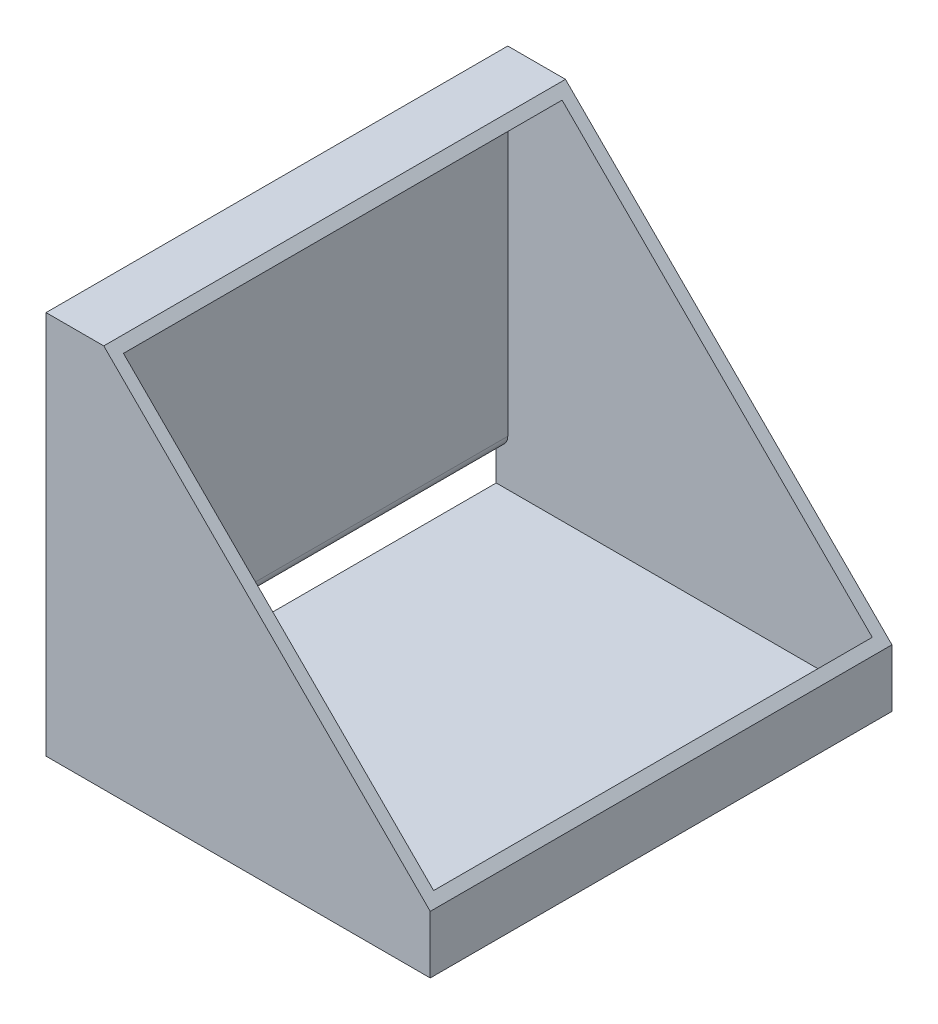
ISO-10303-21;
HEADER;
FILE_DESCRIPTION(('STEP AP214'),'2;1');
FILE_NAME('part.step','',(''),(''),'','','');
FILE_SCHEMA(('AUTOMOTIVE_DESIGN { 1 0 10303 214 1 1 1 1 }'));
ENDSEC;
DATA;
#1=APPLICATION_CONTEXT('core data for automotive mechanical design processes');
#2=APPLICATION_PROTOCOL_DEFINITION('international standard','automotive_design',2000,#1);
#3=PRODUCT_CONTEXT('',#1,'mechanical');
#4=PRODUCT('Part','Part','',(#3));
#5=PRODUCT_RELATED_PRODUCT_CATEGORY('part','',(#4));
#6=PRODUCT_DEFINITION_FORMATION('','',#4);
#7=PRODUCT_DEFINITION_CONTEXT('part definition',#1,'design');
#8=PRODUCT_DEFINITION('design','',#6,#7);
#9=PRODUCT_DEFINITION_SHAPE('','',#8);
#10=(LENGTH_UNIT() NAMED_UNIT(*) SI_UNIT(.MILLI.,.METRE.));
#11=(NAMED_UNIT(*) PLANE_ANGLE_UNIT() SI_UNIT($,.RADIAN.));
#12=(NAMED_UNIT(*) SI_UNIT($,.STERADIAN.) SOLID_ANGLE_UNIT());
#13=UNCERTAINTY_MEASURE_WITH_UNIT(LENGTH_MEASURE(1.E-05),#10,'distance_accuracy_value','');
#14=(GEOMETRIC_REPRESENTATION_CONTEXT(3) GLOBAL_UNCERTAINTY_ASSIGNED_CONTEXT((#13)) GLOBAL_UNIT_ASSIGNED_CONTEXT((#10,
#11,#12)) REPRESENTATION_CONTEXT('',''));
#15=CARTESIAN_POINT('',(0.,0.,0.));
#16=DIRECTION('',(0.,0.,1.));
#17=DIRECTION('',(1.,0.,0.));
#18=AXIS2_PLACEMENT_3D('',#15,#16,#17);
#19=CARTESIAN_POINT('',(18.4350288425444,18.4350288425444,-39.));
#20=DIRECTION('',(0.707106781186548,0.707106781186548,0.));
#21=DIRECTION('',(-0.707106781186548,0.707106781186548,0.));
#22=AXIS2_PLACEMENT_3D('',#19,#20,#21);
#23=PLANE('',#22);
#24=DIRECTION('',(-0.707106781186548,0.707106781186548,0.));
#25=VECTOR('',#24,1.);
#26=CARTESIAN_POINT('',(18.4350288425444,18.4350288425444,-39.));
#27=LINE('',#26,#25);
#28=CARTESIAN_POINT('',(5.00000000000001,31.8700576850888,-39.));
#29=VERTEX_POINT('',#28);
#30=CARTESIAN_POINT('',(4.58578643762691,32.2842712474619,-39.));
#31=VERTEX_POINT('',#30);
#32=EDGE_CURVE('E234',#29,#31,#27,.T.);
#33=ORIENTED_EDGE('',*,*,#32,.F.);
#34=DIRECTION('',(0.,0.,1.));
#35=VECTOR('',#34,1.);
#36=CARTESIAN_POINT('',(5.,31.8700576850888,-39.));
#37=LINE('',#36,#35);
#38=CARTESIAN_POINT('',(5.00000000000001,31.8700576850888,-0.999999999999999));
#39=VERTEX_POINT('',#38);
#40=EDGE_CURVE('E226',#29,#39,#37,.T.);
#41=ORIENTED_EDGE('',*,*,#40,.T.);
#42=DIRECTION('',(-0.707106781186548,0.707106781186548,0.));
#43=VECTOR('',#42,1.);
#44=CARTESIAN_POINT('',(18.4350288425444,18.4350288425444,-1.));
#45=LINE('',#44,#43);
#46=CARTESIAN_POINT('',(4.58578643762691,32.2842712474619,-1.));
#47=VERTEX_POINT('',#46);
#48=EDGE_CURVE('E229',#39,#47,#45,.T.);
#49=ORIENTED_EDGE('',*,*,#48,.T.);
#50=DIRECTION('',(0.,0.,1.));
#51=VECTOR('',#50,1.);
#52=CARTESIAN_POINT('',(4.58578643762691,32.2842712474619,-39.));
#53=LINE('',#52,#51);
#54=EDGE_CURVE('E244',#31,#47,#53,.T.);
#55=ORIENTED_EDGE('',*,*,#54,.F.);
#56=EDGE_LOOP('',(#33,#41,#49,#55));
#57=FACE_BOUND('',#56,.T.);
#58=ADVANCED_FACE('F63',(#57),#23,.F.);
#59=CARTESIAN_POINT('',(32.2842712474619,4.58578643762691,-1.));
#60=VERTEX_POINT('',#59);
#61=CARTESIAN_POINT('',(31.8700576850888,5.00000000000001,-0.999999999999998));
#62=VERTEX_POINT('',#61);
#63=EDGE_CURVE('E245',#60,#62,#45,.T.);
#64=ORIENTED_EDGE('',*,*,#63,.T.);
#65=DIRECTION('',(0.,0.,-1.));
#66=VECTOR('',#65,1.);
#67=CARTESIAN_POINT('',(31.8700576850888,5.,-39.));
#68=LINE('',#67,#66);
#69=CARTESIAN_POINT('',(31.8700576850888,5.,-39.));
#70=VERTEX_POINT('',#69);
#71=EDGE_CURVE('E217',#62,#70,#68,.T.);
#72=ORIENTED_EDGE('',*,*,#71,.T.);
#73=CARTESIAN_POINT('',(32.2842712474619,4.58578643762691,-39.));
#74=VERTEX_POINT('',#73);
#75=EDGE_CURVE('E230',#74,#70,#27,.T.);
#76=ORIENTED_EDGE('',*,*,#75,.F.);
#77=DIRECTION('',(0.,0.,1.));
#78=VECTOR('',#77,1.);
#79=CARTESIAN_POINT('',(32.2842712474619,4.58578643762691,-39.));
#80=LINE('',#79,#78);
#81=EDGE_CURVE('E253',#74,#60,#80,.T.);
#82=ORIENTED_EDGE('',*,*,#81,.T.);
#83=EDGE_LOOP('',(#64,#72,#76,#82));
#84=FACE_BOUND('',#83,.T.);
#85=ADVANCED_FACE('F329',(#84),#23,.F.);
#86=CARTESIAN_POINT('',(32.2842712474619,0.,-39.));
#87=DIRECTION('',(1.,0.,0.));
#88=DIRECTION('',(0.,0.,-1.));
#89=AXIS2_PLACEMENT_3D('',#86,#87,#88);
#90=PLANE('',#89);
#91=DIRECTION('',(0.,1.,0.));
#92=VECTOR('',#91,1.);
#93=CARTESIAN_POINT('',(32.2842712474619,0.,-1.));
#94=LINE('',#93,#92);
#95=CARTESIAN_POINT('',(32.2842712474619,1.,-1.));
#96=VERTEX_POINT('',#95);
#97=EDGE_CURVE('E181',#96,#60,#94,.T.);
#98=ORIENTED_EDGE('',*,*,#97,.T.);
#99=ORIENTED_EDGE('',*,*,#81,.F.);
#100=DIRECTION('',(0.,1.,0.));
#101=VECTOR('',#100,1.);
#102=CARTESIAN_POINT('',(32.2842712474619,0.,-39.));
#103=LINE('',#102,#101);
#104=CARTESIAN_POINT('',(32.2842712474619,1.,-39.));
#105=VERTEX_POINT('',#104);
#106=EDGE_CURVE('E241',#105,#74,#103,.T.);
#107=ORIENTED_EDGE('',*,*,#106,.F.);
#108=DIRECTION('',(0.,0.,1.));
#109=VECTOR('',#108,1.);
#110=CARTESIAN_POINT('',(32.2842712474619,1.,-39.));
#111=LINE('',#110,#109);
#112=EDGE_CURVE('E256',#105,#96,#111,.T.);
#113=ORIENTED_EDGE('',*,*,#112,.T.);
#114=EDGE_LOOP('',(#98,#99,#107,#113));
#115=FACE_BOUND('',#114,.T.);
#116=ADVANCED_FACE('F333',(#115),#90,.F.);
#117=CARTESIAN_POINT('',(0.,1.,-39.));
#118=DIRECTION('',(0.,-1.,0.));
#119=DIRECTION('',(0.,0.,-1.));
#120=AXIS2_PLACEMENT_3D('',#117,#118,#119);
#121=PLANE('',#120);
#122=ORIENTED_EDGE('',*,*,#112,.F.);
#123=DIRECTION('',(1.,0.,0.));
#124=VECTOR('',#123,1.);
#125=CARTESIAN_POINT('',(0.,1.,-39.));
#126=LINE('',#125,#124);
#127=CARTESIAN_POINT('',(0.,1.,-39.));
#128=VERTEX_POINT('',#127);
#129=EDGE_CURVE('E190',#128,#105,#126,.T.);
#130=ORIENTED_EDGE('',*,*,#129,.F.);
#131=DIRECTION('',(0.,0.,1.));
#132=VECTOR('',#131,1.);
#133=CARTESIAN_POINT('',(0.,1.,-39.));
#134=LINE('',#133,#132);
#135=CARTESIAN_POINT('',(0.,1.,-1.));
#136=VERTEX_POINT('',#135);
#137=EDGE_CURVE('E188',#128,#136,#134,.T.);
#138=ORIENTED_EDGE('',*,*,#137,.T.);
#139=DIRECTION('',(1.,0.,0.));
#140=VECTOR('',#139,1.);
#141=CARTESIAN_POINT('',(0.,1.,-1.));
#142=LINE('',#141,#140);
#143=EDGE_CURVE('E173',#136,#96,#142,.T.);
#144=ORIENTED_EDGE('',*,*,#143,.T.);
#145=EDGE_LOOP('',(#122,#130,#138,#144));
#146=FACE_BOUND('',#145,.T.);
#147=ADVANCED_FACE('F189',(#146),#121,.F.);
#148=CARTESIAN_POINT('',(1.,0.,-39.));
#149=DIRECTION('',(-1.,0.,0.));
#150=DIRECTION('',(0.,0.,1.));
#151=AXIS2_PLACEMENT_3D('',#148,#149,#150);
#152=PLANE('',#151);
#153=DIRECTION('',(0.,-1.,0.));
#154=VECTOR('',#153,1.);
#155=CARTESIAN_POINT('',(1.,0.,-1.));
#156=LINE('',#155,#154);
#157=CARTESIAN_POINT('',(1.,32.2842712474619,-1.));
#158=VERTEX_POINT('',#157);
#159=CARTESIAN_POINT('',(1.,5.,-1.));
#160=VERTEX_POINT('',#159);
#161=EDGE_CURVE('E185',#158,#160,#156,.T.);
#162=ORIENTED_EDGE('',*,*,#161,.T.);
#163=DIRECTION('',(0.,0.,-1.));
#164=VECTOR('',#163,1.);
#165=CARTESIAN_POINT('',(1.,5.,-39.));
#166=LINE('',#165,#164);
#167=CARTESIAN_POINT('',(1.,5.,-39.));
#168=VERTEX_POINT('',#167);
#169=EDGE_CURVE('E294',#160,#168,#166,.T.);
#170=ORIENTED_EDGE('',*,*,#169,.T.);
#171=DIRECTION('',(0.,-1.,0.));
#172=VECTOR('',#171,1.);
#173=CARTESIAN_POINT('',(1.,0.,-39.));
#174=LINE('',#173,#172);
#175=CARTESIAN_POINT('',(1.,32.2842712474619,-39.));
#176=VERTEX_POINT('',#175);
#177=EDGE_CURVE('E237',#176,#168,#174,.T.);
#178=ORIENTED_EDGE('',*,*,#177,.F.);
#179=DIRECTION('',(0.,0.,1.));
#180=VECTOR('',#179,1.);
#181=CARTESIAN_POINT('',(1.,32.2842712474619,-39.));
#182=LINE('',#181,#180);
#183=EDGE_CURVE('E258',#176,#158,#182,.T.);
#184=ORIENTED_EDGE('',*,*,#183,.T.);
#185=EDGE_LOOP('',(#162,#170,#178,#184));
#186=FACE_BOUND('',#185,.T.);
#187=ADVANCED_FACE('F306',(#186),#152,.F.);
#188=CARTESIAN_POINT('',(0.,32.2842712474619,-39.));
#189=DIRECTION('',(0.,1.,0.));
#190=DIRECTION('',(0.,0.,1.));
#191=AXIS2_PLACEMENT_3D('',#188,#189,#190);
#192=PLANE('',#191);
#193=DIRECTION('',(-1.,0.,0.));
#194=VECTOR('',#193,1.);
#195=CARTESIAN_POINT('',(0.,32.2842712474619,-1.));
#196=LINE('',#195,#194);
#197=EDGE_CURVE('E248',#47,#158,#196,.T.);
#198=ORIENTED_EDGE('',*,*,#197,.T.);
#199=ORIENTED_EDGE('',*,*,#183,.F.);
#200=DIRECTION('',(-1.,0.,0.));
#201=VECTOR('',#200,1.);
#202=CARTESIAN_POINT('',(0.,32.2842712474619,-39.));
#203=LINE('',#202,#201);
#204=EDGE_CURVE('E233',#31,#176,#203,.T.);
#205=ORIENTED_EDGE('',*,*,#204,.F.);
#206=ORIENTED_EDGE('',*,*,#54,.T.);
#207=EDGE_LOOP('',(#198,#199,#205,#206));
#208=FACE_BOUND('',#207,.T.);
#209=ADVANCED_FACE('F310',(#208),#192,.F.);
#210=CARTESIAN_POINT('',(0.,0.,-39.));
#211=DIRECTION('',(0.,0.,1.));
#212=DIRECTION('',(1.,0.,0.));
#213=AXIS2_PLACEMENT_3D('',#210,#211,#212);
#214=PLANE('',#213);
#215=ORIENTED_EDGE('',*,*,#177,.T.);
#216=CARTESIAN_POINT('',(0.,5.,-39.));
#217=DIRECTION('',(0.,0.,1.));
#218=DIRECTION('',(1.,0.,0.));
#219=AXIS2_PLACEMENT_3D('',#216,#217,#218);
#220=CIRCLE('',#219,1.);
#221=CARTESIAN_POINT('',(0.,4.,-39.));
#222=VERTEX_POINT('',#221);
#223=EDGE_CURVE('E71',#168,#222,#220,.F.);
#224=ORIENTED_EDGE('',*,*,#223,.T.);
#225=DIRECTION('',(0.,-1.,0.));
#226=VECTOR('',#225,1.);
#227=CARTESIAN_POINT('',(0.,1.,-39.));
#228=LINE('',#227,#226);
#229=EDGE_CURVE('E194',#222,#128,#228,.T.);
#230=ORIENTED_EDGE('',*,*,#229,.T.);
#231=ORIENTED_EDGE('',*,*,#129,.T.);
#232=ORIENTED_EDGE('',*,*,#106,.T.);
#233=ORIENTED_EDGE('',*,*,#75,.T.);
#234=DIRECTION('',(0.707106781186548,0.707106781186547,0.));
#235=VECTOR('',#234,1.);
#236=CARTESIAN_POINT('',(31.1629509039023,4.29289321881346,-39.));
#237=LINE('',#236,#235);
#238=CARTESIAN_POINT('',(32.5771644662754,5.70710678118655,-39.));
#239=VERTEX_POINT('',#238);
#240=EDGE_CURVE('E220',#70,#239,#237,.T.);
#241=ORIENTED_EDGE('',*,*,#240,.T.);
#242=DIRECTION('',(-0.707106781186548,0.707106781186548,0.));
#243=VECTOR('',#242,1.);
#244=CARTESIAN_POINT('',(32.5771644662754,5.70710678118655,-39.));
#245=LINE('',#244,#243);
#246=CARTESIAN_POINT('',(5.70710678118656,32.5771644662754,-39.));
#247=VERTEX_POINT('',#246);
#248=EDGE_CURVE('E208',#239,#247,#245,.T.);
#249=ORIENTED_EDGE('',*,*,#248,.T.);
#250=DIRECTION('',(0.707106781186548,0.707106781186547,0.));
#251=VECTOR('',#250,1.);
#252=CARTESIAN_POINT('',(4.29289321881346,31.1629509039023,-39.));
#253=LINE('',#252,#251);
#254=EDGE_CURVE('E218',#29,#247,#253,.T.);
#255=ORIENTED_EDGE('',*,*,#254,.F.);
#256=ORIENTED_EDGE('',*,*,#32,.T.);
#257=ORIENTED_EDGE('',*,*,#204,.T.);
#258=EDGE_LOOP('',(#215,#224,#230,#231,#232,#233,#241,#249,#255,#256,#257));
#259=FACE_BOUND('',#258,.T.);
#260=ADVANCED_FACE('F303',(#259),#214,.T.);
#261=CARTESIAN_POINT('',(0.,0.,-1.));
#262=DIRECTION('',(0.,0.,1.));
#263=DIRECTION('',(1.,0.,0.));
#264=AXIS2_PLACEMENT_3D('',#261,#262,#263);
#265=PLANE('',#264);
#266=ORIENTED_EDGE('',*,*,#143,.F.);
#267=DIRECTION('',(0.,1.,0.));
#268=VECTOR('',#267,1.);
#269=CARTESIAN_POINT('',(0.,1.,-1.));
#270=LINE('',#269,#268);
#271=CARTESIAN_POINT('',(0.,4.,-1.));
#272=VERTEX_POINT('',#271);
#273=EDGE_CURVE('E177',#136,#272,#270,.T.);
#274=ORIENTED_EDGE('',*,*,#273,.T.);
#275=CARTESIAN_POINT('',(0.,5.,-1.));
#276=DIRECTION('',(0.,0.,1.));
#277=DIRECTION('',(1.,0.,0.));
#278=AXIS2_PLACEMENT_3D('',#275,#276,#277);
#279=CIRCLE('',#278,1.);
#280=EDGE_CURVE('E12',#272,#160,#279,.T.);
#281=ORIENTED_EDGE('',*,*,#280,.T.);
#282=ORIENTED_EDGE('',*,*,#161,.F.);
#283=ORIENTED_EDGE('',*,*,#197,.F.);
#284=ORIENTED_EDGE('',*,*,#48,.F.);
#285=DIRECTION('',(0.707106781186548,0.707106781186547,0.));
#286=VECTOR('',#285,1.);
#287=CARTESIAN_POINT('',(4.29289321881346,31.1629509039023,-0.999999999999999));
#288=LINE('',#287,#286);
#289=CARTESIAN_POINT('',(5.70710678118656,32.5771644662754,-0.999999999999999));
#290=VERTEX_POINT('',#289);
#291=EDGE_CURVE('E215',#39,#290,#288,.T.);
#292=ORIENTED_EDGE('',*,*,#291,.T.);
#293=DIRECTION('',(0.707106781186548,-0.707106781186548,0.));
#294=VECTOR('',#293,1.);
#295=CARTESIAN_POINT('',(32.5771644662754,5.70710678118655,-0.999999999999998));
#296=LINE('',#295,#294);
#297=CARTESIAN_POINT('',(32.5771644662754,5.70710678118655,-1.));
#298=VERTEX_POINT('',#297);
#299=EDGE_CURVE('E200',#290,#298,#296,.T.);
#300=ORIENTED_EDGE('',*,*,#299,.T.);
#301=DIRECTION('',(0.707106781186548,0.707106781186547,0.));
#302=VECTOR('',#301,1.);
#303=CARTESIAN_POINT('',(31.1629509039023,4.29289321881346,-0.999999999999998));
#304=LINE('',#303,#302);
#305=EDGE_CURVE('E214',#62,#298,#304,.T.);
#306=ORIENTED_EDGE('',*,*,#305,.F.);
#307=ORIENTED_EDGE('',*,*,#63,.F.);
#308=ORIENTED_EDGE('',*,*,#97,.F.);
#309=EDGE_LOOP('',(#266,#274,#281,#282,#283,#284,#292,#300,#306,#307,#308));
#310=FACE_BOUND('',#309,.T.);
#311=ADVANCED_FACE('F175',(#310),#265,.F.);
#312=CARTESIAN_POINT('',(4.29289321881346,31.1629509039023,-0.999999999999999));
#313=DIRECTION('',(-0.707106781186547,0.707106781186548,0.));
#314=DIRECTION('',(-0.707106781186548,-0.707106781186547,0.));
#315=AXIS2_PLACEMENT_3D('',#312,#313,#314);
#316=PLANE('',#315);
#317=ORIENTED_EDGE('',*,*,#254,.T.);
#318=DIRECTION('',(0.,0.,1.));
#319=VECTOR('',#318,1.);
#320=CARTESIAN_POINT('',(5.70710678118656,32.5771644662754,-0.999999999999999));
#321=LINE('',#320,#319);
#322=EDGE_CURVE('E211',#247,#290,#321,.T.);
#323=ORIENTED_EDGE('',*,*,#322,.T.);
#324=ORIENTED_EDGE('',*,*,#291,.F.);
#325=ORIENTED_EDGE('',*,*,#40,.F.);
#326=EDGE_LOOP('',(#317,#323,#324,#325));
#327=FACE_BOUND('',#326,.T.);
#328=ADVANCED_FACE('F319',(#327),#316,.F.);
#329=CARTESIAN_POINT('',(31.1629509039023,4.29289321881346,-0.999999999999998));
#330=DIRECTION('',(0.707106781186547,-0.707106781186548,0.));
#331=DIRECTION('',(0.707106781186548,0.707106781186547,0.));
#332=AXIS2_PLACEMENT_3D('',#329,#330,#331);
#333=PLANE('',#332);
#334=ORIENTED_EDGE('',*,*,#305,.T.);
#335=DIRECTION('',(0.,0.,-1.));
#336=VECTOR('',#335,1.);
#337=CARTESIAN_POINT('',(32.5771644662754,5.70710678118655,-0.999999999999998));
#338=LINE('',#337,#336);
#339=EDGE_CURVE('E205',#298,#239,#338,.T.);
#340=ORIENTED_EDGE('',*,*,#339,.T.);
#341=ORIENTED_EDGE('',*,*,#240,.F.);
#342=ORIENTED_EDGE('',*,*,#71,.F.);
#343=EDGE_LOOP('',(#334,#340,#341,#342));
#344=FACE_BOUND('',#343,.T.);
#345=ADVANCED_FACE('F327',(#344),#333,.F.);
#346=CARTESIAN_POINT('',(5.,33.2842712474619,-40.));
#347=DIRECTION('',(0.707106781186548,0.707106781186548,0.));
#348=DIRECTION('',(-0.707106781186548,0.707106781186548,0.));
#349=AXIS2_PLACEMENT_3D('',#346,#347,#348);
#350=PLANE('',#349);
#351=ORIENTED_EDGE('',*,*,#299,.F.);
#352=ORIENTED_EDGE('',*,*,#322,.F.);
#353=ORIENTED_EDGE('',*,*,#248,.F.);
#354=ORIENTED_EDGE('',*,*,#339,.F.);
#355=EDGE_LOOP('',(#351,#352,#353,#354));
#356=FACE_BOUND('',#355,.T.);
#357=DIRECTION('',(-0.707106781186548,0.707106781186548,0.));
#358=VECTOR('',#357,1.);
#359=CARTESIAN_POINT('',(5.,33.2842712474619,0.));
#360=LINE('',#359,#358);
#361=CARTESIAN_POINT('',(33.2842712474619,5.,0.));
#362=VERTEX_POINT('',#361);
#363=CARTESIAN_POINT('',(5.,33.2842712474619,0.));
#364=VERTEX_POINT('',#363);
#365=EDGE_CURVE('E255',#362,#364,#360,.T.);
#366=ORIENTED_EDGE('',*,*,#365,.F.);
#367=DIRECTION('',(0.,0.,1.));
#368=VECTOR('',#367,1.);
#369=CARTESIAN_POINT('',(33.2842712474619,5.,-40.));
#370=LINE('',#369,#368);
#371=CARTESIAN_POINT('',(33.2842712474619,5.,-40.));
#372=VERTEX_POINT('',#371);
#373=EDGE_CURVE('E292',#372,#362,#370,.T.);
#374=ORIENTED_EDGE('',*,*,#373,.F.);
#375=DIRECTION('',(-0.707106781186548,0.707106781186548,0.));
#376=VECTOR('',#375,1.);
#377=CARTESIAN_POINT('',(5.,33.2842712474619,-40.));
#378=LINE('',#377,#376);
#379=CARTESIAN_POINT('',(5.,33.2842712474619,-40.));
#380=VERTEX_POINT('',#379);
#381=EDGE_CURVE('E262',#372,#380,#378,.T.);
#382=ORIENTED_EDGE('',*,*,#381,.T.);
#383=DIRECTION('',(0.,0.,1.));
#384=VECTOR('',#383,1.);
#385=CARTESIAN_POINT('',(5.,33.2842712474619,-40.));
#386=LINE('',#385,#384);
#387=EDGE_CURVE('E278',#380,#364,#386,.T.);
#388=ORIENTED_EDGE('',*,*,#387,.T.);
#389=EDGE_LOOP('',(#366,#374,#382,#388));
#390=FACE_BOUND('',#389,.T.);
#391=ADVANCED_FACE('F324',(#356,#390),#350,.T.);
#392=CARTESIAN_POINT('',(33.2842712474619,5.,-40.));
#393=DIRECTION('',(1.,0.,0.));
#394=DIRECTION('',(0.,0.,-1.));
#395=AXIS2_PLACEMENT_3D('',#392,#393,#394);
#396=PLANE('',#395);
#397=DIRECTION('',(0.,1.,0.));
#398=VECTOR('',#397,1.);
#399=CARTESIAN_POINT('',(33.2842712474619,5.,0.));
#400=LINE('',#399,#398);
#401=CARTESIAN_POINT('',(33.2842712474619,0.,0.));
#402=VERTEX_POINT('',#401);
#403=EDGE_CURVE('E266',#402,#362,#400,.T.);
#404=ORIENTED_EDGE('',*,*,#403,.F.);
#405=DIRECTION('',(0.,0.,1.));
#406=VECTOR('',#405,1.);
#407=CARTESIAN_POINT('',(33.2842712474619,0.,-40.));
#408=LINE('',#407,#406);
#409=CARTESIAN_POINT('',(33.2842712474619,0.,-40.));
#410=VERTEX_POINT('',#409);
#411=EDGE_CURVE('E295',#410,#402,#408,.T.);
#412=ORIENTED_EDGE('',*,*,#411,.F.);
#413=DIRECTION('',(0.,1.,0.));
#414=VECTOR('',#413,1.);
#415=CARTESIAN_POINT('',(33.2842712474619,5.,-40.));
#416=LINE('',#415,#414);
#417=EDGE_CURVE('E275',#410,#372,#416,.T.);
#418=ORIENTED_EDGE('',*,*,#417,.T.);
#419=ORIENTED_EDGE('',*,*,#373,.T.);
#420=EDGE_LOOP('',(#404,#412,#418,#419));
#421=FACE_BOUND('',#420,.T.);
#422=ADVANCED_FACE('F358',(#421),#396,.T.);
#423=CARTESIAN_POINT('',(33.2842712474619,0.,-40.));
#424=DIRECTION('',(0.,-1.,0.));
#425=DIRECTION('',(0.,0.,-1.));
#426=AXIS2_PLACEMENT_3D('',#423,#424,#425);
#427=PLANE('',#426);
#428=DIRECTION('',(1.,0.,0.));
#429=VECTOR('',#428,1.);
#430=CARTESIAN_POINT('',(33.2842712474619,0.,0.));
#431=LINE('',#430,#429);
#432=CARTESIAN_POINT('',(0.,0.,0.));
#433=VERTEX_POINT('',#432);
#434=EDGE_CURVE('E287',#433,#402,#431,.T.);
#435=ORIENTED_EDGE('',*,*,#434,.F.);
#436=DIRECTION('',(0.,0.,1.));
#437=VECTOR('',#436,1.);
#438=CARTESIAN_POINT('',(0.,0.,-40.));
#439=LINE('',#438,#437);
#440=CARTESIAN_POINT('',(0.,0.,-40.));
#441=VERTEX_POINT('',#440);
#442=EDGE_CURVE('E297',#441,#433,#439,.T.);
#443=ORIENTED_EDGE('',*,*,#442,.F.);
#444=DIRECTION('',(1.,0.,0.));
#445=VECTOR('',#444,1.);
#446=CARTESIAN_POINT('',(33.2842712474619,0.,-40.));
#447=LINE('',#446,#445);
#448=EDGE_CURVE('E272',#441,#410,#447,.T.);
#449=ORIENTED_EDGE('',*,*,#448,.T.);
#450=ORIENTED_EDGE('',*,*,#411,.T.);
#451=EDGE_LOOP('',(#435,#443,#449,#450));
#452=FACE_BOUND('',#451,.T.);
#453=ADVANCED_FACE('F361',(#452),#427,.T.);
#454=CARTESIAN_POINT('',(0.,33.2842712474619,-40.));
#455=DIRECTION('',(-1.,0.,0.));
#456=DIRECTION('',(0.,0.,1.));
#457=AXIS2_PLACEMENT_3D('',#454,#455,#456);
#458=PLANE('',#457);
#459=ORIENTED_EDGE('',*,*,#229,.F.);
#460=DIRECTION('',(0.,0.,-1.));
#461=VECTOR('',#460,1.);
#462=CARTESIAN_POINT('',(0.,4.,-39.));
#463=LINE('',#462,#461);
#464=EDGE_CURVE('E198',#272,#222,#463,.T.);
#465=ORIENTED_EDGE('',*,*,#464,.F.);
#466=ORIENTED_EDGE('',*,*,#273,.F.);
#467=ORIENTED_EDGE('',*,*,#137,.F.);
#468=EDGE_LOOP('',(#459,#465,#466,#467));
#469=FACE_BOUND('',#468,.T.);
#470=DIRECTION('',(0.,-1.,0.));
#471=VECTOR('',#470,1.);
#472=CARTESIAN_POINT('',(0.,33.2842712474619,0.));
#473=LINE('',#472,#471);
#474=CARTESIAN_POINT('',(0.,33.2842712474619,0.));
#475=VERTEX_POINT('',#474);
#476=EDGE_CURVE('E284',#475,#433,#473,.T.);
#477=ORIENTED_EDGE('',*,*,#476,.F.);
#478=DIRECTION('',(0.,0.,1.));
#479=VECTOR('',#478,1.);
#480=CARTESIAN_POINT('',(0.,33.2842712474619,-40.));
#481=LINE('',#480,#479);
#482=CARTESIAN_POINT('',(0.,33.2842712474619,-40.));
#483=VERTEX_POINT('',#482);
#484=EDGE_CURVE('E299',#483,#475,#481,.T.);
#485=ORIENTED_EDGE('',*,*,#484,.F.);
#486=DIRECTION('',(0.,-1.,0.));
#487=VECTOR('',#486,1.);
#488=CARTESIAN_POINT('',(0.,33.2842712474619,-40.));
#489=LINE('',#488,#487);
#490=EDGE_CURVE('E269',#483,#441,#489,.T.);
#491=ORIENTED_EDGE('',*,*,#490,.T.);
#492=ORIENTED_EDGE('',*,*,#442,.T.);
#493=EDGE_LOOP('',(#477,#485,#491,#492));
#494=FACE_BOUND('',#493,.T.);
#495=ADVANCED_FACE('F196',(#469,#494),#458,.T.);
#496=CARTESIAN_POINT('',(5.,33.2842712474619,-40.));
#497=DIRECTION('',(0.,1.,0.));
#498=DIRECTION('',(0.,0.,1.));
#499=AXIS2_PLACEMENT_3D('',#496,#497,#498);
#500=PLANE('',#499);
#501=DIRECTION('',(-1.,0.,0.));
#502=VECTOR('',#501,1.);
#503=CARTESIAN_POINT('',(5.,33.2842712474619,0.));
#504=LINE('',#503,#502);
#505=EDGE_CURVE('E281',#364,#475,#504,.T.);
#506=ORIENTED_EDGE('',*,*,#505,.F.);
#507=ORIENTED_EDGE('',*,*,#387,.F.);
#508=DIRECTION('',(-1.,0.,0.));
#509=VECTOR('',#508,1.);
#510=CARTESIAN_POINT('',(5.,33.2842712474619,-40.));
#511=LINE('',#510,#509);
#512=EDGE_CURVE('E265',#380,#483,#511,.T.);
#513=ORIENTED_EDGE('',*,*,#512,.T.);
#514=ORIENTED_EDGE('',*,*,#484,.T.);
#515=EDGE_LOOP('',(#506,#507,#513,#514));
#516=FACE_BOUND('',#515,.T.);
#517=ADVANCED_FACE('F353',(#516),#500,.T.);
#518=CARTESIAN_POINT('',(0.,0.,-40.));
#519=DIRECTION('',(0.,0.,1.));
#520=DIRECTION('',(1.,0.,0.));
#521=AXIS2_PLACEMENT_3D('',#518,#519,#520);
#522=PLANE('',#521);
#523=ORIENTED_EDGE('',*,*,#381,.F.);
#524=ORIENTED_EDGE('',*,*,#417,.F.);
#525=ORIENTED_EDGE('',*,*,#448,.F.);
#526=ORIENTED_EDGE('',*,*,#490,.F.);
#527=ORIENTED_EDGE('',*,*,#512,.F.);
#528=EDGE_LOOP('',(#523,#524,#525,#526,#527));
#529=FACE_BOUND('',#528,.T.);
#530=ADVANCED_FACE('F349',(#529),#522,.F.);
#531=CARTESIAN_POINT('',(0.,0.,0.));
#532=DIRECTION('',(0.,0.,1.));
#533=DIRECTION('',(1.,0.,0.));
#534=AXIS2_PLACEMENT_3D('',#531,#532,#533);
#535=PLANE('',#534);
#536=ORIENTED_EDGE('',*,*,#365,.T.);
#537=ORIENTED_EDGE('',*,*,#505,.T.);
#538=ORIENTED_EDGE('',*,*,#476,.T.);
#539=ORIENTED_EDGE('',*,*,#434,.T.);
#540=ORIENTED_EDGE('',*,*,#403,.T.);
#541=EDGE_LOOP('',(#536,#537,#538,#539,#540));
#542=FACE_BOUND('',#541,.T.);
#543=ADVANCED_FACE('F352',(#542),#535,.T.);
#544=CARTESIAN_POINT('',(0.,5.,-39.));
#545=DIRECTION('',(0.,0.,-1.));
#546=DIRECTION('',(-1.,0.,0.));
#547=AXIS2_PLACEMENT_3D('',#544,#545,#546);
#548=CYLINDRICAL_SURFACE('',#547,1.);
#549=ORIENTED_EDGE('',*,*,#280,.F.);
#550=ORIENTED_EDGE('',*,*,#464,.T.);
#551=ORIENTED_EDGE('',*,*,#223,.F.);
#552=ORIENTED_EDGE('',*,*,#169,.F.);
#553=EDGE_LOOP('',(#549,#550,#551,#552));
#554=FACE_BOUND('',#553,.T.);
#555=ADVANCED_FACE('F65',(#554),#548,.T.);
#556=CLOSED_SHELL('',(#58,#85,#116,#147,#187,#209,#260,#311,#328,#345,#391,#422,#453,#495,#517,
#530,#543,#555));
#557=MANIFOLD_SOLID_BREP('B2',#556);
#558=ADVANCED_BREP_SHAPE_REPRESENTATION('',(#18,#557),#14);
#559=SHAPE_DEFINITION_REPRESENTATION(#9,#558);
ENDSEC;
END-ISO-10303-21;
